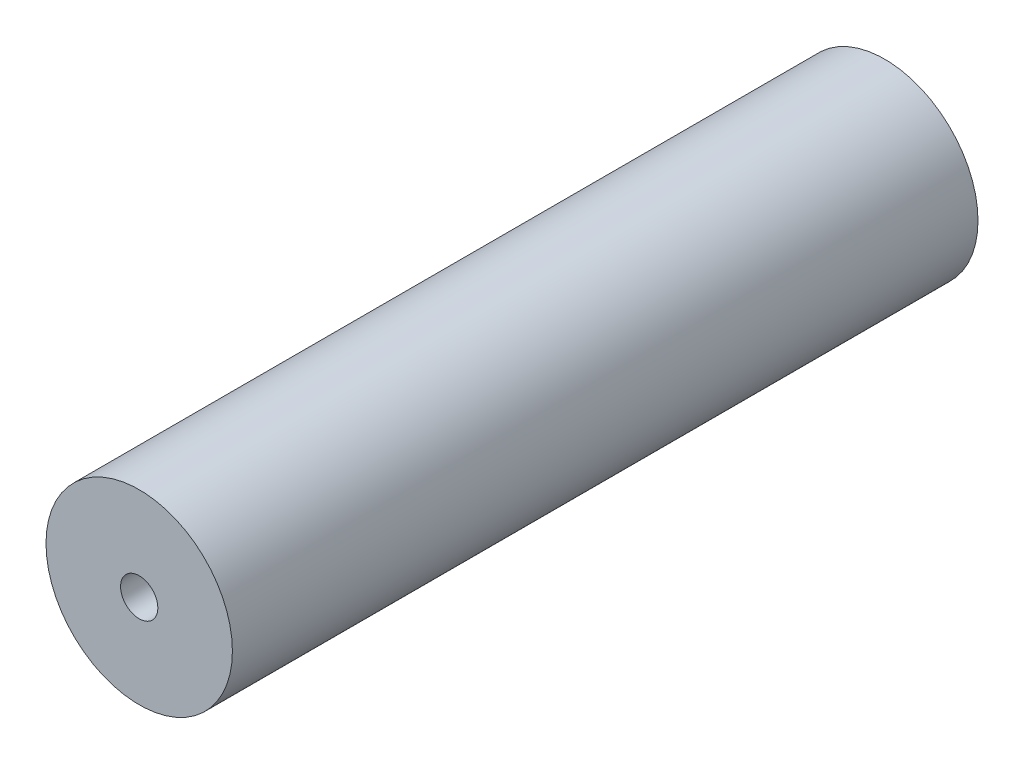
ISO-10303-21;
HEADER;
FILE_DESCRIPTION(('STEP AP214'),'2;1');
FILE_NAME('part.step','',(''),(''),'','','');
FILE_SCHEMA(('AUTOMOTIVE_DESIGN { 1 0 10303 214 1 1 1 1 }'));
ENDSEC;
DATA;
#1=APPLICATION_CONTEXT('core data for automotive mechanical design processes');
#2=APPLICATION_PROTOCOL_DEFINITION('international standard','automotive_design',2000,#1);
#3=PRODUCT_CONTEXT('',#1,'mechanical');
#4=PRODUCT('Part','Part','',(#3));
#5=PRODUCT_RELATED_PRODUCT_CATEGORY('part','',(#4));
#6=PRODUCT_DEFINITION_FORMATION('','',#4);
#7=PRODUCT_DEFINITION_CONTEXT('part definition',#1,'design');
#8=PRODUCT_DEFINITION('design','',#6,#7);
#9=PRODUCT_DEFINITION_SHAPE('','',#8);
#10=(LENGTH_UNIT() NAMED_UNIT(*) SI_UNIT(.MILLI.,.METRE.));
#11=(NAMED_UNIT(*) PLANE_ANGLE_UNIT() SI_UNIT($,.RADIAN.));
#12=(NAMED_UNIT(*) SI_UNIT($,.STERADIAN.) SOLID_ANGLE_UNIT());
#13=UNCERTAINTY_MEASURE_WITH_UNIT(LENGTH_MEASURE(1.E-05),#10,'distance_accuracy_value','');
#14=(GEOMETRIC_REPRESENTATION_CONTEXT(3) GLOBAL_UNCERTAINTY_ASSIGNED_CONTEXT((#13)) GLOBAL_UNIT_ASSIGNED_CONTEXT((#10,
#11,#12)) REPRESENTATION_CONTEXT('',''));
#15=CARTESIAN_POINT('',(0.,0.,0.));
#16=DIRECTION('',(0.,0.,1.));
#17=DIRECTION('',(1.,0.,0.));
#18=AXIS2_PLACEMENT_3D('',#15,#16,#17);
#19=CARTESIAN_POINT('',(0.,0.,80.));
#20=DIRECTION('',(0.,0.,-1.));
#21=DIRECTION('',(-1.,0.,0.));
#22=AXIS2_PLACEMENT_3D('',#19,#20,#21);
#23=CYLINDRICAL_SURFACE('',#22,10.);
#24=CARTESIAN_POINT('',(0.,0.,80.));
#25=DIRECTION('',(0.,0.,1.));
#26=DIRECTION('',(1.,0.,0.));
#27=AXIS2_PLACEMENT_3D('',#24,#25,#26);
#28=CIRCLE('',#27,10.);
#29=CARTESIAN_POINT('',(10.,0.,80.));
#30=VERTEX_POINT('',#29);
#31=EDGE_CURVE('E10',#30,#30,#28,.T.);
#32=ORIENTED_EDGE('',*,*,#31,.F.);
#33=EDGE_LOOP('',(#32));
#34=FACE_BOUND('',#33,.T.);
#35=CARTESIAN_POINT('',(0.,0.,0.));
#36=DIRECTION('',(0.,0.,1.));
#37=DIRECTION('',(1.,0.,0.));
#38=AXIS2_PLACEMENT_3D('',#35,#36,#37);
#39=CIRCLE('',#38,10.);
#40=CARTESIAN_POINT('',(10.,0.,0.));
#41=VERTEX_POINT('',#40);
#42=EDGE_CURVE('E40',#41,#41,#39,.T.);
#43=ORIENTED_EDGE('',*,*,#42,.T.);
#44=EDGE_LOOP('',(#43));
#45=FACE_BOUND('',#44,.T.);
#46=ADVANCED_FACE('F37',(#34,#45),#23,.T.);
#47=CARTESIAN_POINT('',(0.,0.,80.));
#48=DIRECTION('',(0.,0.,1.));
#49=DIRECTION('',(1.,0.,0.));
#50=AXIS2_PLACEMENT_3D('',#47,#48,#49);
#51=PLANE('',#50);
#52=CARTESIAN_POINT('',(0.,0.,80.));
#53=DIRECTION('',(0.,0.,1.));
#54=DIRECTION('',(1.,0.,0.));
#55=AXIS2_PLACEMENT_3D('',#52,#53,#54);
#56=CIRCLE('',#55,2.);
#57=CARTESIAN_POINT('',(2.,0.,80.));
#58=VERTEX_POINT('',#57);
#59=EDGE_CURVE('E51',#58,#58,#56,.T.);
#60=ORIENTED_EDGE('',*,*,#59,.F.);
#61=EDGE_LOOP('',(#60));
#62=FACE_BOUND('',#61,.T.);
#63=ORIENTED_EDGE('',*,*,#31,.T.);
#64=EDGE_LOOP('',(#63));
#65=FACE_BOUND('',#64,.T.);
#66=ADVANCED_FACE('F68',(#62,#65),#51,.T.);
#67=CARTESIAN_POINT('',(0.,0.,0.));
#68=DIRECTION('',(0.,0.,1.));
#69=DIRECTION('',(1.,0.,0.));
#70=AXIS2_PLACEMENT_3D('',#67,#68,#69);
#71=PLANE('',#70);
#72=CARTESIAN_POINT('',(0.,0.,0.));
#73=DIRECTION('',(0.,0.,1.));
#74=DIRECTION('',(1.,0.,0.));
#75=AXIS2_PLACEMENT_3D('',#72,#73,#74);
#76=CIRCLE('',#75,2.);
#77=CARTESIAN_POINT('',(2.,0.,0.));
#78=VERTEX_POINT('',#77);
#79=EDGE_CURVE('E49',#78,#78,#76,.T.);
#80=ORIENTED_EDGE('',*,*,#79,.T.);
#81=EDGE_LOOP('',(#80));
#82=FACE_BOUND('',#81,.T.);
#83=ORIENTED_EDGE('',*,*,#42,.F.);
#84=EDGE_LOOP('',(#83));
#85=FACE_BOUND('',#84,.T.);
#86=ADVANCED_FACE('F59',(#82,#85),#71,.F.);
#87=CARTESIAN_POINT('',(0.,0.,0.));
#88=DIRECTION('',(0.,0.,1.));
#89=DIRECTION('',(1.,0.,0.));
#90=AXIS2_PLACEMENT_3D('',#87,#88,#89);
#91=CYLINDRICAL_SURFACE('',#90,2.);
#92=ORIENTED_EDGE('',*,*,#79,.F.);
#93=EDGE_LOOP('',(#92));
#94=FACE_BOUND('',#93,.T.);
#95=ORIENTED_EDGE('',*,*,#59,.T.);
#96=EDGE_LOOP('',(#95));
#97=FACE_BOUND('',#96,.T.);
#98=ADVANCED_FACE('F62',(#94,#97),#91,.F.);
#99=CLOSED_SHELL('',(#46,#66,#86,#98));
#100=MANIFOLD_SOLID_BREP('B2',#99);
#101=ADVANCED_BREP_SHAPE_REPRESENTATION('',(#18,#100),#14);
#102=SHAPE_DEFINITION_REPRESENTATION(#9,#101);
ENDSEC;
END-ISO-10303-21;
